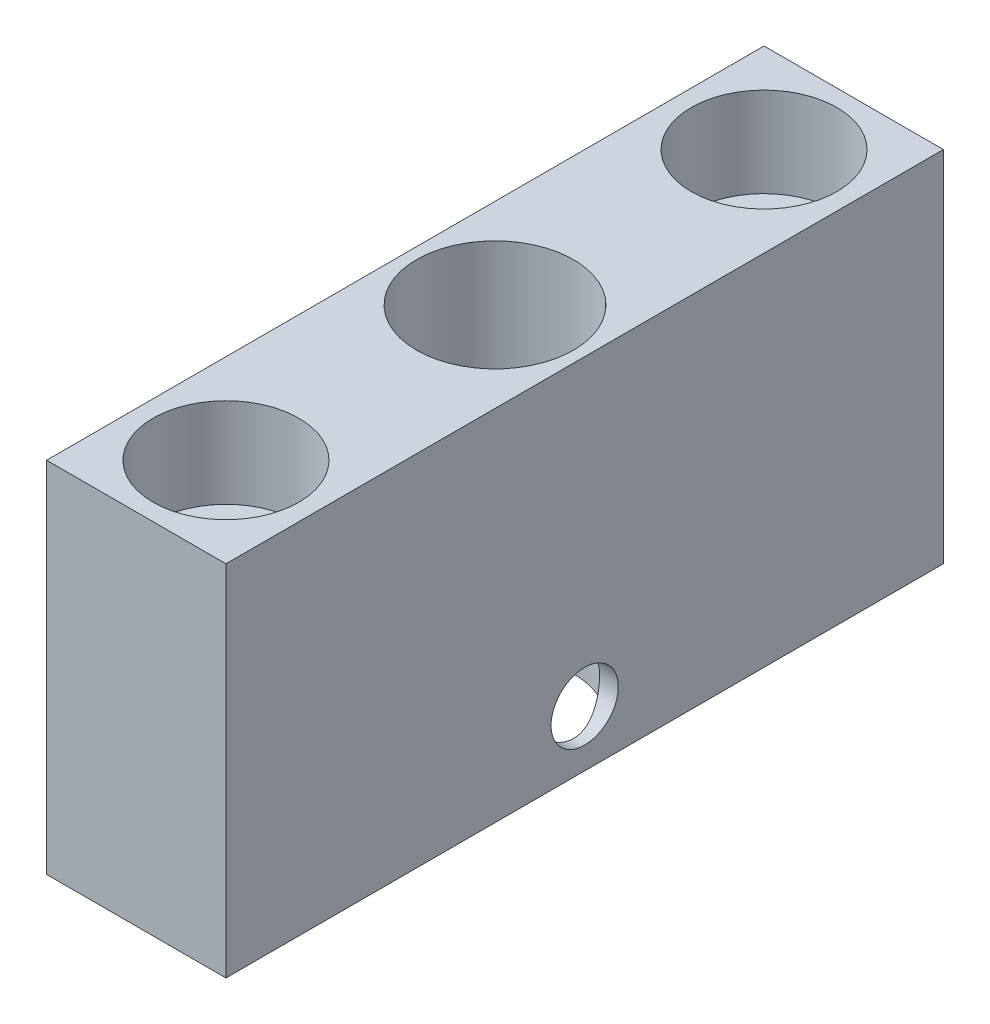
ISO-10303-21;
HEADER;
FILE_DESCRIPTION(('STEP AP214'),'2;1');
FILE_NAME('part.step','',(''),(''),'','','');
FILE_SCHEMA(('AUTOMOTIVE_DESIGN { 1 0 10303 214 1 1 1 1 }'));
ENDSEC;
DATA;
#1=APPLICATION_CONTEXT('core data for automotive mechanical design processes');
#2=APPLICATION_PROTOCOL_DEFINITION('international standard','automotive_design',2000,#1);
#3=PRODUCT_CONTEXT('',#1,'mechanical');
#4=PRODUCT('Part','Part','',(#3));
#5=PRODUCT_RELATED_PRODUCT_CATEGORY('part','',(#4));
#6=PRODUCT_DEFINITION_FORMATION('','',#4);
#7=PRODUCT_DEFINITION_CONTEXT('part definition',#1,'design');
#8=PRODUCT_DEFINITION('design','',#6,#7);
#9=PRODUCT_DEFINITION_SHAPE('','',#8);
#10=(LENGTH_UNIT() NAMED_UNIT(*) SI_UNIT(.MILLI.,.METRE.));
#11=(NAMED_UNIT(*) PLANE_ANGLE_UNIT() SI_UNIT($,.RADIAN.));
#12=(NAMED_UNIT(*) SI_UNIT($,.STERADIAN.) SOLID_ANGLE_UNIT());
#13=UNCERTAINTY_MEASURE_WITH_UNIT(LENGTH_MEASURE(1.E-05),#10,'distance_accuracy_value','');
#14=(GEOMETRIC_REPRESENTATION_CONTEXT(3) GLOBAL_UNCERTAINTY_ASSIGNED_CONTEXT((#13)) GLOBAL_UNIT_ASSIGNED_CONTEXT((#10,
#11,#12)) REPRESENTATION_CONTEXT('',''));
#15=CARTESIAN_POINT('',(0.,0.,0.));
#16=DIRECTION('',(0.,0.,1.));
#17=DIRECTION('',(1.,0.,0.));
#18=AXIS2_PLACEMENT_3D('',#15,#16,#17);
#19=CARTESIAN_POINT('',(25.4,50.8,0.));
#20=DIRECTION('',(0.,-1.,0.));
#21=DIRECTION('',(0.,0.,-1.));
#22=AXIS2_PLACEMENT_3D('',#19,#20,#21);
#23=PLANE('',#22);
#24=CARTESIAN_POINT('',(12.7,50.8,-12.7));
#25=DIRECTION('',(0.,1.,0.));
#26=DIRECTION('',(0.,0.,1.));
#27=AXIS2_PLACEMENT_3D('',#24,#25,#26);
#28=CIRCLE('',#27,10.31875);
#29=CARTESIAN_POINT('',(12.7,50.8,-2.38125));
#30=VERTEX_POINT('',#29);
#31=EDGE_CURVE('E195',#30,#30,#28,.T.);
#32=ORIENTED_EDGE('',*,*,#31,.F.);
#33=EDGE_LOOP('',(#32));
#34=FACE_BOUND('',#33,.T.);
#35=CARTESIAN_POINT('',(12.7,50.8,-50.8));
#36=DIRECTION('',(0.,1.,0.));
#37=DIRECTION('',(0.,0.,1.));
#38=AXIS2_PLACEMENT_3D('',#35,#36,#37);
#39=CIRCLE('',#38,11.1125);
#40=CARTESIAN_POINT('',(12.7,50.8,-39.6875));
#41=VERTEX_POINT('',#40);
#42=EDGE_CURVE('E183',#41,#41,#39,.T.);
#43=ORIENTED_EDGE('',*,*,#42,.F.);
#44=EDGE_LOOP('',(#43));
#45=FACE_BOUND('',#44,.T.);
#46=DIRECTION('',(0.,0.,1.));
#47=VECTOR('',#46,1.);
#48=CARTESIAN_POINT('',(0.,50.8,0.));
#49=LINE('',#48,#47);
#50=CARTESIAN_POINT('',(0.,50.8,-101.6));
#51=VERTEX_POINT('',#50);
#52=CARTESIAN_POINT('',(0.,50.8,0.));
#53=VERTEX_POINT('',#52);
#54=EDGE_CURVE('E79',#51,#53,#49,.T.);
#55=ORIENTED_EDGE('',*,*,#54,.T.);
#56=DIRECTION('',(-1.,0.,0.));
#57=VECTOR('',#56,1.);
#58=CARTESIAN_POINT('',(25.4,50.8,0.));
#59=LINE('',#58,#57);
#60=CARTESIAN_POINT('',(25.4,50.8,0.));
#61=VERTEX_POINT('',#60);
#62=EDGE_CURVE('E100',#61,#53,#59,.T.);
#63=ORIENTED_EDGE('',*,*,#62,.F.);
#64=DIRECTION('',(0.,0.,1.));
#65=VECTOR('',#64,1.);
#66=CARTESIAN_POINT('',(25.4,50.8,0.));
#67=LINE('',#66,#65);
#68=CARTESIAN_POINT('',(25.4,50.8,-101.6));
#69=VERTEX_POINT('',#68);
#70=EDGE_CURVE('E56',#69,#61,#67,.T.);
#71=ORIENTED_EDGE('',*,*,#70,.F.);
#72=DIRECTION('',(-1.,0.,0.));
#73=VECTOR('',#72,1.);
#74=CARTESIAN_POINT('',(25.4,50.8,-101.6));
#75=LINE('',#74,#73);
#76=EDGE_CURVE('E96',#69,#51,#75,.T.);
#77=ORIENTED_EDGE('',*,*,#76,.T.);
#78=EDGE_LOOP('',(#55,#63,#71,#77));
#79=FACE_BOUND('',#78,.T.);
#80=CARTESIAN_POINT('',(12.7,50.8,-88.9));
#81=DIRECTION('',(0.,1.,0.));
#82=DIRECTION('',(0.,0.,1.));
#83=AXIS2_PLACEMENT_3D('',#80,#81,#82);
#84=CIRCLE('',#83,10.31875);
#85=CARTESIAN_POINT('',(12.7,50.8,-78.58125));
#86=VERTEX_POINT('',#85);
#87=EDGE_CURVE('E205',#86,#86,#84,.T.);
#88=ORIENTED_EDGE('',*,*,#87,.F.);
#89=EDGE_LOOP('',(#88));
#90=FACE_BOUND('',#89,.T.);
#91=ADVANCED_FACE('F33',(#34,#45,#79,#90),#23,.F.);
#92=CARTESIAN_POINT('',(25.4,0.,0.));
#93=DIRECTION('',(0.,0.,-1.));
#94=DIRECTION('',(-1.,0.,0.));
#95=AXIS2_PLACEMENT_3D('',#92,#93,#94);
#96=PLANE('',#95);
#97=DIRECTION('',(0.,-1.,0.));
#98=VECTOR('',#97,1.);
#99=CARTESIAN_POINT('',(0.,0.,0.));
#100=LINE('',#99,#98);
#101=CARTESIAN_POINT('',(0.,0.,0.));
#102=VERTEX_POINT('',#101);
#103=EDGE_CURVE('E104',#53,#102,#100,.T.);
#104=ORIENTED_EDGE('',*,*,#103,.T.);
#105=DIRECTION('',(-1.,0.,0.));
#106=VECTOR('',#105,1.);
#107=CARTESIAN_POINT('',(25.4,0.,0.));
#108=LINE('',#107,#106);
#109=CARTESIAN_POINT('',(25.4,0.,0.));
#110=VERTEX_POINT('',#109);
#111=EDGE_CURVE('E11',#110,#102,#108,.T.);
#112=ORIENTED_EDGE('',*,*,#111,.F.);
#113=DIRECTION('',(0.,-1.,0.));
#114=VECTOR('',#113,1.);
#115=CARTESIAN_POINT('',(25.4,0.,0.));
#116=LINE('',#115,#114);
#117=EDGE_CURVE('E91',#61,#110,#116,.T.);
#118=ORIENTED_EDGE('',*,*,#117,.F.);
#119=ORIENTED_EDGE('',*,*,#62,.T.);
#120=EDGE_LOOP('',(#104,#112,#118,#119));
#121=FACE_BOUND('',#120,.T.);
#122=ADVANCED_FACE('F35',(#121),#96,.F.);
#123=CARTESIAN_POINT('',(25.4,0.,0.));
#124=DIRECTION('',(0.,1.,0.));
#125=DIRECTION('',(0.,0.,1.));
#126=AXIS2_PLACEMENT_3D('',#123,#124,#125);
#127=PLANE('',#126);
#128=CARTESIAN_POINT('',(12.7,0.,-88.9));
#129=DIRECTION('',(0.,1.,0.));
#130=DIRECTION('',(0.,0.,1.));
#131=AXIS2_PLACEMENT_3D('',#128,#129,#130);
#132=CIRCLE('',#131,6.74623999999999);
#133=CARTESIAN_POINT('',(12.7,0.,-82.15376));
#134=VERTEX_POINT('',#133);
#135=EDGE_CURVE('E176',#134,#134,#132,.T.);
#136=ORIENTED_EDGE('',*,*,#135,.T.);
#137=EDGE_LOOP('',(#136));
#138=FACE_BOUND('',#137,.T.);
#139=CARTESIAN_POINT('',(12.7,0.,-12.7));
#140=DIRECTION('',(0.,1.,0.));
#141=DIRECTION('',(0.,0.,1.));
#142=AXIS2_PLACEMENT_3D('',#139,#140,#141);
#143=CIRCLE('',#142,6.74623999999999);
#144=CARTESIAN_POINT('',(12.7,0.,-5.95376000000001));
#145=VERTEX_POINT('',#144);
#146=EDGE_CURVE('E179',#145,#145,#143,.T.);
#147=ORIENTED_EDGE('',*,*,#146,.T.);
#148=EDGE_LOOP('',(#147));
#149=FACE_BOUND('',#148,.T.);
#150=CARTESIAN_POINT('',(12.7,0.,-50.8));
#151=DIRECTION('',(0.,1.,0.));
#152=DIRECTION('',(0.,0.,1.));
#153=AXIS2_PLACEMENT_3D('',#150,#151,#152);
#154=CIRCLE('',#153,11.1125);
#155=CARTESIAN_POINT('',(12.7,0.,-39.6875));
#156=VERTEX_POINT('',#155);
#157=EDGE_CURVE('E107',#156,#156,#154,.T.);
#158=ORIENTED_EDGE('',*,*,#157,.T.);
#159=EDGE_LOOP('',(#158));
#160=FACE_BOUND('',#159,.T.);
#161=DIRECTION('',(0.,0.,-1.));
#162=VECTOR('',#161,1.);
#163=CARTESIAN_POINT('',(0.,0.,0.));
#164=LINE('',#163,#162);
#165=CARTESIAN_POINT('',(0.,0.,-101.6));
#166=VERTEX_POINT('',#165);
#167=EDGE_CURVE('E95',#102,#166,#164,.T.);
#168=ORIENTED_EDGE('',*,*,#167,.T.);
#169=DIRECTION('',(-1.,0.,0.));
#170=VECTOR('',#169,1.);
#171=CARTESIAN_POINT('',(25.4,0.,-101.6));
#172=LINE('',#171,#170);
#173=CARTESIAN_POINT('',(25.4,0.,-101.6));
#174=VERTEX_POINT('',#173);
#175=EDGE_CURVE('E47',#174,#166,#172,.T.);
#176=ORIENTED_EDGE('',*,*,#175,.F.);
#177=DIRECTION('',(0.,0.,-1.));
#178=VECTOR('',#177,1.);
#179=CARTESIAN_POINT('',(25.4,0.,0.));
#180=LINE('',#179,#178);
#181=EDGE_CURVE('E86',#110,#174,#180,.T.);
#182=ORIENTED_EDGE('',*,*,#181,.F.);
#183=ORIENTED_EDGE('',*,*,#111,.T.);
#184=EDGE_LOOP('',(#168,#176,#182,#183));
#185=FACE_BOUND('',#184,.T.);
#186=ADVANCED_FACE('F94',(#138,#149,#160,#185),#127,.F.);
#187=CARTESIAN_POINT('',(25.4,0.,-101.6));
#188=DIRECTION('',(0.,0.,1.));
#189=DIRECTION('',(1.,0.,0.));
#190=AXIS2_PLACEMENT_3D('',#187,#188,#189);
#191=PLANE('',#190);
#192=DIRECTION('',(0.,1.,0.));
#193=VECTOR('',#192,1.);
#194=CARTESIAN_POINT('',(0.,0.,-101.6));
#195=LINE('',#194,#193);
#196=EDGE_CURVE('E73',#166,#51,#195,.T.);
#197=ORIENTED_EDGE('',*,*,#196,.T.);
#198=ORIENTED_EDGE('',*,*,#76,.F.);
#199=DIRECTION('',(0.,1.,0.));
#200=VECTOR('',#199,1.);
#201=CARTESIAN_POINT('',(25.4,0.,-101.6));
#202=LINE('',#201,#200);
#203=EDGE_CURVE('E89',#174,#69,#202,.T.);
#204=ORIENTED_EDGE('',*,*,#203,.F.);
#205=ORIENTED_EDGE('',*,*,#175,.T.);
#206=EDGE_LOOP('',(#197,#198,#204,#205));
#207=FACE_BOUND('',#206,.T.);
#208=ADVANCED_FACE('F98',(#207),#191,.F.);
#209=CARTESIAN_POINT('',(25.4,0.,0.));
#210=DIRECTION('',(-1.,0.,0.));
#211=DIRECTION('',(0.,0.,1.));
#212=AXIS2_PLACEMENT_3D('',#209,#210,#211);
#213=PLANE('',#212);
#214=CARTESIAN_POINT('',(25.4,7.93749999999999,-50.8));
#215=DIRECTION('',(-1.,0.,0.));
#216=DIRECTION('',(0.,0.,1.));
#217=AXIS2_PLACEMENT_3D('',#214,#215,#216);
#218=CIRCLE('',#217,4.7625);
#219=CARTESIAN_POINT('',(25.4,7.93749999999999,-46.0375));
#220=VERTEX_POINT('',#219);
#221=EDGE_CURVE('E116',#220,#220,#218,.T.);
#222=ORIENTED_EDGE('',*,*,#221,.T.);
#223=EDGE_LOOP('',(#222));
#224=FACE_BOUND('',#223,.T.);
#225=ORIENTED_EDGE('',*,*,#117,.T.);
#226=ORIENTED_EDGE('',*,*,#181,.T.);
#227=ORIENTED_EDGE('',*,*,#203,.T.);
#228=ORIENTED_EDGE('',*,*,#70,.T.);
#229=EDGE_LOOP('',(#225,#226,#227,#228));
#230=FACE_BOUND('',#229,.T.);
#231=ADVANCED_FACE('F87',(#224,#230),#213,.F.);
#232=CARTESIAN_POINT('',(0.,0.,0.));
#233=DIRECTION('',(-1.,0.,0.));
#234=DIRECTION('',(0.,0.,1.));
#235=AXIS2_PLACEMENT_3D('',#232,#233,#234);
#236=PLANE('',#235);
#237=CARTESIAN_POINT('',(0.,7.93749999999999,-50.8));
#238=DIRECTION('',(-1.,0.,0.));
#239=DIRECTION('',(0.,0.,1.));
#240=AXIS2_PLACEMENT_3D('',#237,#238,#239);
#241=CIRCLE('',#240,4.7625);
#242=CARTESIAN_POINT('',(0.,7.93749999999999,-46.0375));
#243=VERTEX_POINT('',#242);
#244=EDGE_CURVE('E208',#243,#243,#241,.T.);
#245=ORIENTED_EDGE('',*,*,#244,.F.);
#246=EDGE_LOOP('',(#245));
#247=FACE_BOUND('',#246,.T.);
#248=ORIENTED_EDGE('',*,*,#103,.F.);
#249=ORIENTED_EDGE('',*,*,#54,.F.);
#250=ORIENTED_EDGE('',*,*,#196,.F.);
#251=ORIENTED_EDGE('',*,*,#167,.F.);
#252=EDGE_LOOP('',(#248,#249,#250,#251));
#253=FACE_BOUND('',#252,.T.);
#254=ADVANCED_FACE('F153',(#247,#253),#236,.T.);
#255=CARTESIAN_POINT('',(12.7,0.,-50.8));
#256=DIRECTION('',(0.,1.,0.));
#257=DIRECTION('',(0.,0.,1.));
#258=AXIS2_PLACEMENT_3D('',#255,#256,#257);
#259=CYLINDRICAL_SURFACE('',#258,11.1125);
#260=CARTESIAN_POINT('',(22.7402315710346,7.93749999999999,-46.0375));
#261=CARTESIAN_POINT('',(22.7402325969404,7.81081711955315,-46.0375009563788));
#262=CARTESIAN_POINT('',(22.7426375136056,7.68409356669935,-46.0425619607115));
#263=CARTESIAN_POINT('',(22.7521773469959,7.43157495339823,-46.0627531724795));
#264=CARTESIAN_POINT('',(22.7593152367777,7.30578052684223,-46.0778897089675));
#265=CARTESIAN_POINT('',(22.7780939995445,7.05586201053338,-46.1181018772274));
#266=CARTESIAN_POINT('',(22.7897441420218,6.93174190706319,-46.1431979714881));
#267=CARTESIAN_POINT('',(22.8171598826129,6.68627553562086,-46.2030646893261));
#268=CARTESIAN_POINT('',(22.8329272184985,6.56493046250162,-46.2378393984311));
#269=CARTESIAN_POINT('',(22.8679895638285,6.32641028596406,-46.3165316645889));
#270=CARTESIAN_POINT('',(22.8872676592125,6.20921827599237,-46.3604055189373));
#271=CARTESIAN_POINT('',(22.9288238220674,5.97907704550573,-46.4570075256631));
#272=CARTESIAN_POINT('',(22.9511030202539,5.86612944475673,-46.509739017162));
#273=CARTESIAN_POINT('',(23.0214847106019,5.53473411010628,-46.6805615431649));
#274=CARTESIAN_POINT('',(23.0731764446023,5.32344355082248,-46.8113772371487));
#275=CARTESIAN_POINT('',(23.1840302210821,4.91256550730841,-47.1121887461931));
#276=CARTESIAN_POINT('',(23.2434541391098,4.71443353112619,-47.284059781686));
#277=CARTESIAN_POINT('',(23.3609693699898,4.34862281350912,-47.658384469874));
#278=CARTESIAN_POINT('',(23.4190601433558,4.18095621711117,-47.8608502605265));
#279=CARTESIAN_POINT('',(23.5020251157082,3.95217119433691,-48.1889630020797));
#280=CARTESIAN_POINT('',(23.529543805133,3.87833617785003,-48.3052775653519));
#281=CARTESIAN_POINT('',(23.5818420364386,3.74080074445626,-48.5443172030064));
#282=CARTESIAN_POINT('',(23.6066227201098,3.67709609812437,-48.6670395735549));
#283=CARTESIAN_POINT('',(23.6527361704598,3.56039435942118,-48.9181062685213));
#284=CARTESIAN_POINT('',(23.6740686566785,3.50739813793502,-49.0464510491614));
#285=CARTESIAN_POINT('',(23.7126442464736,3.41268453784225,-49.3077700416603));
#286=CARTESIAN_POINT('',(23.7298894226294,3.37096144138833,-49.4407418678532));
#287=CARTESIAN_POINT('',(23.7589645161395,3.30118728442444,-49.7029986863095));
#288=CARTESIAN_POINT('',(23.7710375060906,3.27251718465848,-49.8320921980915));
#289=CARTESIAN_POINT('',(23.7907227036859,3.22599010247466,-50.0924945957469));
#290=CARTESIAN_POINT('',(23.7983369227396,3.2081282441973,-50.2238024551533));
#291=CARTESIAN_POINT('',(23.8088927374394,3.18340987866286,-50.4876167517058));
#292=CARTESIAN_POINT('',(23.8118350655803,3.17655164617131,-50.6201229976826));
#293=CARTESIAN_POINT('',(23.8129635440452,3.17391827416849,-50.8852632517531));
#294=CARTESIAN_POINT('',(23.8111498916125,3.17814267503059,-51.0178972543203));
#295=CARTESIAN_POINT('',(23.8030899023065,3.1969915207815,-51.2736572238331));
#296=CARTESIAN_POINT('',(23.7971374396123,3.21092660137181,-51.3968439819731));
#297=CARTESIAN_POINT('',(23.7812677768779,3.24830694302233,-51.6415464574278));
#298=CARTESIAN_POINT('',(23.7713492698737,3.27175533912293,-51.7630616102162));
#299=CARTESIAN_POINT('',(23.7477949789557,3.3279256747242,-52.0035215780315));
#300=CARTESIAN_POINT('',(23.734160430392,3.36064453252227,-52.1224672330975));
#301=CARTESIAN_POINT('',(23.7035070800928,3.43504991614925,-52.3570875456178));
#302=CARTESIAN_POINT('',(23.6864869858923,3.4767398672792,-52.4727609345299));
#303=CARTESIAN_POINT('',(23.6303729511955,3.61613562312503,-52.8171892422505));
#304=CARTESIAN_POINT('',(23.5865804410412,3.72735286321166,-53.0398847261039));
#305=CARTESIAN_POINT('',(23.4906732532717,3.98196726986346,-53.4639196547825));
#306=CARTESIAN_POINT('',(23.4385555878285,4.12537599719917,-53.6652513889999));
#307=CARTESIAN_POINT('',(23.3266292662245,4.45262138276372,-54.0568159113248));
#308=CARTESIAN_POINT('',(23.2665368722658,4.63866362567251,-54.2451265366349));
#309=CARTESIAN_POINT('',(23.1482447303289,5.03988209313429,-54.588792131285));
#310=CARTESIAN_POINT('',(23.0900458084769,5.2550708284467,-54.7441328748182));
#311=CARTESIAN_POINT('',(23.0080841218763,5.60008928812737,-54.9517319893531));
#312=CARTESIAN_POINT('',(22.9812256744591,5.72117264752324,-55.0176264196652));
#313=CARTESIAN_POINT('',(22.9306452318648,5.96911134117193,-55.1388785284375));
#314=CARTESIAN_POINT('',(22.9069218642793,6.09596411690436,-55.1942408221287));
#315=CARTESIAN_POINT('',(22.8634458090569,6.35458276658959,-55.293883043541));
#316=CARTESIAN_POINT('',(22.8436924590987,6.48634781666808,-55.3381648201362));
#317=CARTESIAN_POINT('',(22.8089032030434,6.75376488742944,-55.4151402633162));
#318=CARTESIAN_POINT('',(22.7938647576959,6.88941477279269,-55.4478401686471));
#319=CARTESIAN_POINT('',(22.7699246654428,7.15433232140047,-55.4994709480565));
#320=CARTESIAN_POINT('',(22.7606790992216,7.28341791242463,-55.5191781527133));
#321=CARTESIAN_POINT('',(22.7471446489349,7.5429754466383,-55.5479253704658));
#322=CARTESIAN_POINT('',(22.7428534835363,7.67344672381315,-55.5569702932199));
#323=CARTESIAN_POINT('',(22.7393821403968,7.93474312753004,-55.5642920886695));
#324=CARTESIAN_POINT('',(22.7402013386981,8.06556820892421,-55.562570275946));
#325=CARTESIAN_POINT('',(22.7469178556913,8.32649805848893,-55.5483848535375));
#326=CARTESIAN_POINT('',(22.7528150033793,8.45660285076728,-55.5359216055784));
#327=CARTESIAN_POINT('',(22.7688871369255,8.70602210688869,-55.5016485340732));
#328=CARTESIAN_POINT('',(22.7787349853001,8.8254561296551,-55.4805514170496));
#329=CARTESIAN_POINT('',(22.8023216104455,9.06201631435729,-55.4294206385016));
#330=CARTESIAN_POINT('',(22.816061655543,9.17914171066591,-55.3993840637682));
#331=CARTESIAN_POINT('',(22.8625277917537,9.52589509681601,-55.2962707749795));
#332=CARTESIAN_POINT('',(22.9005128967651,9.75108699188258,-55.2101644074141));
#333=CARTESIAN_POINT('',(22.9882190863004,10.1937090721676,-55.0016008796227));
#334=CARTESIAN_POINT('',(23.0383786296689,10.4103760840485,-54.8777260071983));
#335=CARTESIAN_POINT('',(23.1441893772466,10.8209410272629,-54.5985352919396));
#336=CARTESIAN_POINT('',(23.1998430461826,11.014828653301,-54.4432053048334));
#337=CARTESIAN_POINT('',(23.3162454816267,11.3919725300852,-54.0894453640814));
#338=CARTESIAN_POINT('',(23.3770159298943,11.5728329421733,-53.8884401852249));
#339=CARTESIAN_POINT('',(23.4634529566788,11.8171208649245,-53.5655457006457));
#340=CARTESIAN_POINT('',(23.4914946070146,11.8940886308069,-53.4542749287281));
#341=CARTESIAN_POINT('',(23.5452693574178,12.038488849397,-53.2252004550138));
#342=CARTESIAN_POINT('',(23.5710034517024,12.1059254159359,-53.1073996024677));
#343=CARTESIAN_POINT('',(23.6195894546555,12.2310447636973,-52.865321094792));
#344=CARTESIAN_POINT('',(23.6424249231112,12.2886724901005,-52.7410116927326));
#345=CARTESIAN_POINT('',(23.684391391894,12.3931585921314,-52.4873972280789));
#346=CARTESIAN_POINT('',(23.703523997519,12.4400216362133,-52.3580943595918));
#347=CARTESIAN_POINT('',(23.737527784676,12.5224952762375,-52.0954405312268));
#348=CARTESIAN_POINT('',(23.7524002298111,12.5581092090931,-51.9620907846959));
#349=CARTESIAN_POINT('',(23.7774386369058,12.6176847498363,-51.6923815889954));
#350=CARTESIAN_POINT('',(23.7876049776739,12.641647295587,-51.5560223829923));
#351=CARTESIAN_POINT('',(23.8023543434429,12.676302269857,-51.2915478069043));
#352=CARTESIAN_POINT('',(23.8072925381708,12.6878399259913,-51.1635623458025));
#353=CARTESIAN_POINT('',(23.8127267199299,12.7005325481124,-50.9069365060749));
#354=CARTESIAN_POINT('',(23.8132212167406,12.701684031035,-50.7782959222193));
#355=CARTESIAN_POINT('',(23.8097508682729,12.6935832074007,-50.5214763083617));
#356=CARTESIAN_POINT('',(23.8057885052258,12.6843366919705,-50.3932970612895));
#357=CARTESIAN_POINT('',(23.7935147439634,12.655549189478,-50.1382647070866));
#358=CARTESIAN_POINT('',(23.7852017282081,12.6360043735661,-50.0114121110989));
#359=CARTESIAN_POINT('',(23.7648587180221,12.58780188604,-49.765000058004));
#360=CARTESIAN_POINT('',(23.7529889280872,12.5595356744361,-49.6453507026645));
#361=CARTESIAN_POINT('',(23.7257344865117,12.493973333606,-49.4089475465436));
#362=CARTESIAN_POINT('',(23.7103486120573,12.4566740626179,-49.2921947688223));
#363=CARTESIAN_POINT('',(23.6594457022784,12.3317084906314,-48.9474404480888));
#364=CARTESIAN_POINT('',(23.6191657761472,12.2309343468457,-48.7247404838586));
#365=CARTESIAN_POINT('',(23.5275103738181,11.9922956185013,-48.2891051269723));
#366=CARTESIAN_POINT('',(23.4757125102392,11.8529485534729,-48.0770788292141));
#367=CARTESIAN_POINT('',(23.3670759497092,11.5432333315046,-47.6784838070674));
#368=CARTESIAN_POINT('',(23.3102352629014,11.3728529008783,-47.4919252064003));
#369=CARTESIAN_POINT('',(23.1926674661581,10.9911877634417,-47.1353926399548));
#370=CARTESIAN_POINT('',(23.1319579298297,10.777830943723,-46.9676073671342));
#371=CARTESIAN_POINT('',(23.0463176018151,10.4379227536367,-46.7444166644606));
#372=CARTESIAN_POINT('',(23.0186531320894,10.3211976917029,-46.6747194535614));
#373=CARTESIAN_POINT('',(22.9659877031333,10.0817641380894,-46.5453529397522));
#374=CARTESIAN_POINT('',(22.9409855344711,9.95905840056385,-46.4856790762542));
#375=CARTESIAN_POINT('',(22.8944995742002,9.70857282965038,-46.3769544233052));
#376=CARTESIAN_POINT('',(22.8730114805165,9.58079944216751,-46.3278906204867));
#377=CARTESIAN_POINT('',(22.8342864121107,9.32097238715718,-46.2408150478807));
#378=CARTESIAN_POINT('',(22.8170473340895,9.18892087411469,-46.2027978082762));
#379=CARTESIAN_POINT('',(22.7874998003113,8.92186199191321,-46.1383199649313));
#380=CARTESIAN_POINT('',(22.7751783660065,8.78686340838854,-46.1118289245687));
#381=CARTESIAN_POINT('',(22.7558994206209,8.51477350400633,-46.0706166078036));
#382=CARTESIAN_POINT('',(22.7489377991736,8.3776838691965,-46.0558863119268));
#383=CARTESIAN_POINT('',(22.7432747601674,8.18981511399056,-46.0439201771626));
#384=CARTESIAN_POINT('',(22.7421344611403,8.13939161144365,-46.0415134125));
#385=CARTESIAN_POINT('',(22.7406126560461,8.03848089379232,-46.0383031204881));
#386=CARTESIAN_POINT('',(22.7402311621257,7.98799367768092,-46.0374996188034));
#387=CARTESIAN_POINT('',(22.7402315710346,7.93749999999999,-46.0375));
#388=B_SPLINE_CURVE_WITH_KNOTS('',3,(#260,#261,#262,#263,#264,#265,#266,#267,#268,#269,#270,
#271,#272,#273,#274,#275,#276,#277,#278,#279,#280,#281,#282,#283,#284,#285,#286,#287,#288,#289,
#290,#291,#292,#293,#294,#295,#296,#297,#298,#299,#300,#301,#302,#303,#304,#305,#306,#307,#308,
#309,#310,#311,#312,#313,#314,#315,#316,#317,#318,#319,#320,#321,#322,#323,#324,#325,#326,#327,
#328,#329,#330,#331,#332,#333,#334,#335,#336,#337,#338,#339,#340,#341,#342,#343,#344,#345,#346,
#347,#348,#349,#350,#351,#352,#353,#354,#355,#356,#357,#358,#359,#360,#361,#362,#363,#364,#365,
#366,#367,#368,#369,#370,#371,#372,#373,#374,#375,#376,#377,#378,#379,#380,#381,#382,#383,#384,
#385,#386,#387),.UNSPECIFIED.,.T.,.F.,(4,2,2,2,2,2,2,2,2,2,2,2,2,2,2,2,2,2,2,2,2,2,2,2,2,2,2,2,
2,2,2,2,2,2,2,2,2,2,2,2,2,2,2,2,2,2,2,2,2,2,2,2,2,2,2,2,2,2,2,2,2,2,2,4),(0.,0.37999614743422,
0.76023121903024,1.14125158394574,1.52243302938755,1.90182440554225,2.28135912565192,
3.03951136369128,3.84300275967303,4.64681376843501,5.06784254342269,5.48869507495356,
5.90958181943645,6.33025468327845,6.72810029452656,7.1257662939162,7.52336993802682,
7.92095709270492,8.29286402725796,8.66489362057616,9.03679968798994,9.40884800760228,
10.1635571437602,10.9185377497518,11.7293564208535,12.5405242350144,12.9614018841596,
13.3820946757899,13.8027172245334,14.2231128529017,14.6153153058753,15.0073370908476,
15.3993110122572,15.7912717341618,16.1558879487007,16.5206231154771,17.2495332786101,
18.0101355645941,18.7710806294892,19.598285755281,20.0123966307314,20.4263282192943,
20.8425115379309,21.25851402294,21.6743929896754,22.090238475231,22.4755480808171,
22.8609868974451,23.2462111516252,23.631578731155,24.0016878682786,24.3719259173178,
25.1117880001847,25.8854064142082,26.6593314610766,27.4894672598559,27.9052589143608,
28.3208608696201,28.7359501560337,29.1508335551684,29.5646146445828,29.978078094037,
30.1295357794085,30.2809958892581),.UNSPECIFIED.);
#389=CARTESIAN_POINT('',(22.7402315710346,7.93749999999999,-46.0375));
#390=VERTEX_POINT('',#389);
#391=EDGE_CURVE('E37',#390,#390,#388,.T.);
#392=ORIENTED_EDGE('',*,*,#391,.T.);
#393=EDGE_LOOP('',(#392));
#394=FACE_BOUND('',#393,.T.);
#395=CARTESIAN_POINT('',(2.65976842896539,7.93749999999999,-46.0375));
#396=CARTESIAN_POINT('',(2.65976740305958,8.06418288044683,-46.0375009563788));
#397=CARTESIAN_POINT('',(2.65736248639442,8.19090643330063,-46.0425619607115));
#398=CARTESIAN_POINT('',(2.64782265300405,8.44342504660175,-46.0627531724795));
#399=CARTESIAN_POINT('',(2.64068476322232,8.56921947315775,-46.0778897089675));
#400=CARTESIAN_POINT('',(2.62190600045549,8.8191379894666,-46.1181018772274));
#401=CARTESIAN_POINT('',(2.61025585797822,8.9432580929368,-46.1431979714881));
#402=CARTESIAN_POINT('',(2.58284011738707,9.18872446437912,-46.2030646893261));
#403=CARTESIAN_POINT('',(2.5670727815015,9.31006953749836,-46.2378393984311));
#404=CARTESIAN_POINT('',(2.53201043617152,9.54858971403593,-46.3165316645889));
#405=CARTESIAN_POINT('',(2.51273234078748,9.66578172400762,-46.3604055189373));
#406=CARTESIAN_POINT('',(2.47117617793261,9.89592295449426,-46.4570075256631));
#407=CARTESIAN_POINT('',(2.4488969797461,10.0088705552433,-46.509739017162));
#408=CARTESIAN_POINT('',(2.37851528939814,10.3402658898937,-46.6805615431649));
#409=CARTESIAN_POINT('',(2.32682355539766,10.5515564491775,-46.8113772371487));
#410=CARTESIAN_POINT('',(2.21596977891787,10.9624344926916,-47.1121887461931));
#411=CARTESIAN_POINT('',(2.15654586089017,11.1605664688738,-47.284059781686));
#412=CARTESIAN_POINT('',(2.0390306300102,11.5263771864909,-47.658384469874));
#413=CARTESIAN_POINT('',(1.98093985664415,11.6940437828888,-47.8608502605264));
#414=CARTESIAN_POINT('',(1.89797488429183,11.9228288056631,-48.1889630020797));
#415=CARTESIAN_POINT('',(1.87045619486702,11.9966638221499,-48.3052775653518));
#416=CARTESIAN_POINT('',(1.81815796356143,12.1341992555437,-48.5443172030064));
#417=CARTESIAN_POINT('',(1.79337727989024,12.1979039018756,-48.6670395735549));
#418=CARTESIAN_POINT('',(1.74726382954022,12.3146056405788,-48.9181062685212));
#419=CARTESIAN_POINT('',(1.72593134332148,12.367601862065,-49.0464510491614));
#420=CARTESIAN_POINT('',(1.68735575352639,12.4623154621577,-49.3077700416603));
#421=CARTESIAN_POINT('',(1.67011057737059,12.5040385586117,-49.4407418678532));
#422=CARTESIAN_POINT('',(1.6410354838605,12.5738127155755,-49.7029986863095));
#423=CARTESIAN_POINT('',(1.62896249390939,12.6024828153415,-49.8320921980915));
#424=CARTESIAN_POINT('',(1.60927729631405,12.6490098975253,-50.0924945957469));
#425=CARTESIAN_POINT('',(1.60166307726037,12.6668717558027,-50.2238024551533));
#426=CARTESIAN_POINT('',(1.59110726256061,12.6915901213371,-50.4876167517058));
#427=CARTESIAN_POINT('',(1.5881649344197,12.6984483538287,-50.6201229976826));
#428=CARTESIAN_POINT('',(1.5870364559548,12.7010817258315,-50.8852632517531));
#429=CARTESIAN_POINT('',(1.5888501083875,12.6968573249694,-51.0178972543203));
#430=CARTESIAN_POINT('',(1.59691009769355,12.6780084792185,-51.2736572238331));
#431=CARTESIAN_POINT('',(1.60286256038772,12.6640733986282,-51.3968439819731));
#432=CARTESIAN_POINT('',(1.61873222312206,12.6266930569777,-51.6415464574278));
#433=CARTESIAN_POINT('',(1.62865073012625,12.603244660877,-51.7630616102162));
#434=CARTESIAN_POINT('',(1.65220502104428,12.5470743252758,-52.0035215780315));
#435=CARTESIAN_POINT('',(1.66583956960801,12.5143554674777,-52.1224672330975));
#436=CARTESIAN_POINT('',(1.69649291990723,12.4399500838507,-52.3570875456178));
#437=CARTESIAN_POINT('',(1.71351301410774,12.3982601327208,-52.4727609345299));
#438=CARTESIAN_POINT('',(1.76962704880446,12.258864376875,-52.8171892422505));
#439=CARTESIAN_POINT('',(1.81341955895881,12.1476471367883,-53.0398847261039));
#440=CARTESIAN_POINT('',(1.9093267467283,11.8930327301365,-53.4639196547825));
#441=CARTESIAN_POINT('',(1.96144441217155,11.7496240028008,-53.6652513889999));
#442=CARTESIAN_POINT('',(2.0733707337755,11.4223786172363,-54.0568159113248));
#443=CARTESIAN_POINT('',(2.13346312773416,11.2363363743275,-54.2451265366349));
#444=CARTESIAN_POINT('',(2.25175526967113,10.8351179068657,-54.588792131285));
#445=CARTESIAN_POINT('',(2.3099541915231,10.6199291715533,-54.7441328748182));
#446=CARTESIAN_POINT('',(2.39191587812367,10.2749107118726,-54.9517319893531));
#447=CARTESIAN_POINT('',(2.41877432554094,10.1538273524767,-55.0176264196652));
#448=CARTESIAN_POINT('',(2.46935476813524,9.90588865882805,-55.1388785284375));
#449=CARTESIAN_POINT('',(2.49307813572074,9.77903588309562,-55.1942408221287));
#450=CARTESIAN_POINT('',(2.53655419094312,9.52041723341039,-55.293883043541));
#451=CARTESIAN_POINT('',(2.55630754090128,9.38865218333191,-55.3381648201362));
#452=CARTESIAN_POINT('',(2.59109679695663,9.12123511257055,-55.4151402633162));
#453=CARTESIAN_POINT('',(2.60613524230408,8.98558522720729,-55.4478401686471));
#454=CARTESIAN_POINT('',(2.63007533455724,8.72066767859951,-55.4994709480565));
#455=CARTESIAN_POINT('',(2.6393209007784,8.59158208757536,-55.5191781527133));
#456=CARTESIAN_POINT('',(2.65285535106512,8.33202455336169,-55.5479253704658));
#457=CARTESIAN_POINT('',(2.65714651646368,8.20155327618684,-55.5569702932199));
#458=CARTESIAN_POINT('',(2.66061785960321,7.94025687246994,-55.5642920886695));
#459=CARTESIAN_POINT('',(2.65979866130186,7.80943179107577,-55.562570275946));
#460=CARTESIAN_POINT('',(2.65308214430868,7.54850194151105,-55.5483848535375));
#461=CARTESIAN_POINT('',(2.64718499662069,7.4183971492327,-55.5359216055784));
#462=CARTESIAN_POINT('',(2.63111286307451,7.1689778931113,-55.5016485340732));
#463=CARTESIAN_POINT('',(2.62126501469993,7.04954387034488,-55.4805514170496));
#464=CARTESIAN_POINT('',(2.59767838955453,6.81298368564269,-55.4294206385016));
#465=CARTESIAN_POINT('',(2.58393834445702,6.69585828933407,-55.3993840637682));
#466=CARTESIAN_POINT('',(2.53747220824626,6.34910490318397,-55.2962707749795));
#467=CARTESIAN_POINT('',(2.49948710323492,6.12391300811741,-55.2101644074141));
#468=CARTESIAN_POINT('',(2.41178091369962,5.68129092783241,-55.0016008796227));
#469=CARTESIAN_POINT('',(2.36162137033108,5.4646239159515,-54.8777260071983));
#470=CARTESIAN_POINT('',(2.2558106227534,5.05405897273709,-54.5985352919396));
#471=CARTESIAN_POINT('',(2.20015695381737,4.86017134669897,-54.4432053048334));
#472=CARTESIAN_POINT('',(2.08375451837329,4.48302746991482,-54.0894453640814));
#473=CARTESIAN_POINT('',(2.0229840701057,4.30216705782668,-53.8884401852249));
#474=CARTESIAN_POINT('',(1.93654704332118,4.05787913507552,-53.5655457006457));
#475=CARTESIAN_POINT('',(1.9085053929854,3.9809113691931,-53.4542749287281));
#476=CARTESIAN_POINT('',(1.85473064258224,3.83651115060302,-53.2252004550138));
#477=CARTESIAN_POINT('',(1.82899654829764,3.76907458406405,-53.1073996024677));
#478=CARTESIAN_POINT('',(1.78041054534446,3.64395523630263,-52.865321094792));
#479=CARTESIAN_POINT('',(1.75757507688882,3.58632750989946,-52.7410116927326));
#480=CARTESIAN_POINT('',(1.71560860810597,3.4818414078686,-52.4873972280789));
#481=CARTESIAN_POINT('',(1.69647600248099,3.43497836378666,-52.3580943595918));
#482=CARTESIAN_POINT('',(1.66247221532404,3.35250472376253,-52.0954405312268));
#483=CARTESIAN_POINT('',(1.64759977018889,3.3168907909069,-51.9620907846959));
#484=CARTESIAN_POINT('',(1.6225613630942,3.25731525016373,-51.6923815889954));
#485=CARTESIAN_POINT('',(1.61239502232609,3.23335270441295,-51.5560223829923));
#486=CARTESIAN_POINT('',(1.59764565655714,3.19869773014296,-51.2915478069043));
#487=CARTESIAN_POINT('',(1.59270746182917,3.18716007400867,-51.1635623458025));
#488=CARTESIAN_POINT('',(1.58727328007006,3.17446745188754,-50.9069365060749));
#489=CARTESIAN_POINT('',(1.58677878325938,3.17331596896501,-50.7782959222193));
#490=CARTESIAN_POINT('',(1.59024913172711,3.18141679259929,-50.5214763083617));
#491=CARTESIAN_POINT('',(1.59421149477424,3.19066330802944,-50.3932970612895));
#492=CARTESIAN_POINT('',(1.60648525603657,3.21945081052203,-50.1382647070866));
#493=CARTESIAN_POINT('',(1.61479827179193,3.23899562643391,-50.0114121110989));
#494=CARTESIAN_POINT('',(1.63514128197787,3.28719811396001,-49.765000058004));
#495=CARTESIAN_POINT('',(1.64701107191282,3.31546432556388,-49.6453507026645));
#496=CARTESIAN_POINT('',(1.67426551348831,3.38102666639394,-49.4089475465436));
#497=CARTESIAN_POINT('',(1.68965138794274,3.41832593738206,-49.2921947688223));
#498=CARTESIAN_POINT('',(1.74055429772163,3.54329150936861,-48.9474404480888));
#499=CARTESIAN_POINT('',(1.78083422385285,3.64406565315429,-48.7247404838586));
#500=CARTESIAN_POINT('',(1.87248962618192,3.8827043814987,-48.2891051269723));
#501=CARTESIAN_POINT('',(1.92428748976079,4.02205144652708,-48.0770788292141));
#502=CARTESIAN_POINT('',(2.03292405029084,4.33176666849541,-47.6784838070674));
#503=CARTESIAN_POINT('',(2.0897647370986,4.50214709912172,-47.4919252064003));
#504=CARTESIAN_POINT('',(2.20733253384185,4.88381223655832,-47.1353926399548));
#505=CARTESIAN_POINT('',(2.26804207017027,5.09716905627702,-46.9676073671342));
#506=CARTESIAN_POINT('',(2.35368239818489,5.43707724636331,-46.7444166644606));
#507=CARTESIAN_POINT('',(2.38134686791061,5.55380230829704,-46.6747194535614));
#508=CARTESIAN_POINT('',(2.43401229686673,5.79323586191062,-46.5453529397522));
#509=CARTESIAN_POINT('',(2.4590144655289,5.91594159943613,-46.4856790762542));
#510=CARTESIAN_POINT('',(2.50550042579978,6.16642717034961,-46.3769544233052));
#511=CARTESIAN_POINT('',(2.52698851948345,6.29420055783248,-46.3278906204867));
#512=CARTESIAN_POINT('',(2.56571358788928,6.55402761284281,-46.2408150478807));
#513=CARTESIAN_POINT('',(2.58295266591051,6.6860791258853,-46.2027978082761));
#514=CARTESIAN_POINT('',(2.6125001996887,6.95313800808678,-46.1383199649313));
#515=CARTESIAN_POINT('',(2.62482163399347,7.08813659161145,-46.1118289245687));
#516=CARTESIAN_POINT('',(2.64410057937906,7.36022649599366,-46.0706166078036));
#517=CARTESIAN_POINT('',(2.65106220082642,7.49731613080349,-46.0558863119268));
#518=CARTESIAN_POINT('',(2.65672523983259,7.68518488600944,-46.0439201771626));
#519=CARTESIAN_POINT('',(2.65786553885967,7.73560838855634,-46.0415134125));
#520=CARTESIAN_POINT('',(2.6593873439539,7.83651910620767,-46.0383031204881));
#521=CARTESIAN_POINT('',(2.65976883787429,7.88700632231907,-46.0374996188034));
#522=CARTESIAN_POINT('',(2.65976842896539,7.93749999999999,-46.0375));
#523=B_SPLINE_CURVE_WITH_KNOTS('',3,(#395,#396,#397,#398,#399,#400,#401,#402,#403,#404,#405,
#406,#407,#408,#409,#410,#411,#412,#413,#414,#415,#416,#417,#418,#419,#420,#421,#422,#423,#424,
#425,#426,#427,#428,#429,#430,#431,#432,#433,#434,#435,#436,#437,#438,#439,#440,#441,#442,#443,
#444,#445,#446,#447,#448,#449,#450,#451,#452,#453,#454,#455,#456,#457,#458,#459,#460,#461,#462,
#463,#464,#465,#466,#467,#468,#469,#470,#471,#472,#473,#474,#475,#476,#477,#478,#479,#480,#481,
#482,#483,#484,#485,#486,#487,#488,#489,#490,#491,#492,#493,#494,#495,#496,#497,#498,#499,#500,
#501,#502,#503,#504,#505,#506,#507,#508,#509,#510,#511,#512,#513,#514,#515,#516,#517,#518,#519,
#520,#521,#522),.UNSPECIFIED.,.T.,.F.,(4,2,2,2,2,2,2,2,2,2,2,2,2,2,2,2,2,2,2,2,2,2,2,2,2,2,2,2,
2,2,2,2,2,2,2,2,2,2,2,2,2,2,2,2,2,2,2,2,2,2,2,2,2,2,2,2,2,2,2,2,2,2,2,4),(0.,0.379996147434217,
0.760231219030237,1.14125158394574,1.52243302938755,1.90182440554225,2.28135912565192,
3.03951136369128,3.84300275967303,4.64681376843501,5.06784254342268,5.48869507495356,
5.90958181943643,6.33025468327845,6.72810029452656,7.1257662939162,7.52336993802681,
7.92095709270492,8.29286402725796,8.66489362057616,9.03679968798993,9.40884800760228,
10.1635571437602,10.9185377497518,11.7293564208535,12.5405242350144,12.9614018841596,
13.3820946757899,13.8027172245334,14.2231128529017,14.6153153058753,15.0073370908476,
15.3993110122572,15.7912717341618,16.1558879487007,16.5206231154771,17.2495332786101,
18.0101355645941,18.7710806294892,19.598285755281,20.0123966307314,20.4263282192943,
20.8425115379309,21.25851402294,21.6743929896754,22.090238475231,22.4755480808171,
22.8609868974451,23.2462111516252,23.631578731155,24.0016878682787,24.3719259173178,
25.1117880001847,25.8854064142082,26.6593314610767,27.4894672598559,27.9052589143608,
28.3208608696201,28.7359501560337,29.1508335551684,29.5646146445828,29.978078094037,
30.1295357794085,30.2809958892581),.UNSPECIFIED.);
#524=CARTESIAN_POINT('',(2.65976842896539,7.93749999999999,-46.0375));
#525=VERTEX_POINT('',#524);
#526=EDGE_CURVE('E112',#525,#525,#523,.T.);
#527=ORIENTED_EDGE('',*,*,#526,.T.);
#528=EDGE_LOOP('',(#527));
#529=FACE_BOUND('',#528,.T.);
#530=ORIENTED_EDGE('',*,*,#157,.F.);
#531=EDGE_LOOP('',(#530));
#532=FACE_BOUND('',#531,.T.);
#533=ORIENTED_EDGE('',*,*,#42,.T.);
#534=EDGE_LOOP('',(#533));
#535=FACE_BOUND('',#534,.T.);
#536=ADVANCED_FACE('F117',(#394,#529,#532,#535),#259,.F.);
#537=CARTESIAN_POINT('',(12.7,50.8,-12.7));
#538=DIRECTION('',(0.,1.,0.));
#539=DIRECTION('',(0.,0.,1.));
#540=AXIS2_PLACEMENT_3D('',#537,#538,#539);
#541=CYLINDRICAL_SURFACE('',#540,6.74623999999999);
#542=ORIENTED_EDGE('',*,*,#146,.F.);
#543=EDGE_LOOP('',(#542));
#544=FACE_BOUND('',#543,.T.);
#545=CARTESIAN_POINT('',(12.7,38.1,-12.7));
#546=DIRECTION('',(0.,1.,0.));
#547=DIRECTION('',(0.,0.,1.));
#548=AXIS2_PLACEMENT_3D('',#545,#546,#547);
#549=CIRCLE('',#548,6.74623999999999);
#550=CARTESIAN_POINT('',(12.7,38.1,-5.95376));
#551=VERTEX_POINT('',#550);
#552=EDGE_CURVE('E189',#551,#551,#549,.T.);
#553=ORIENTED_EDGE('',*,*,#552,.T.);
#554=EDGE_LOOP('',(#553));
#555=FACE_BOUND('',#554,.T.);
#556=ADVANCED_FACE('F146',(#544,#555),#541,.F.);
#557=CARTESIAN_POINT('',(19.44624,38.1,-12.7));
#558=DIRECTION('',(0.,-1.,0.));
#559=DIRECTION('',(0.,0.,-1.));
#560=AXIS2_PLACEMENT_3D('',#557,#558,#559);
#561=PLANE('',#560);
#562=ORIENTED_EDGE('',*,*,#552,.F.);
#563=EDGE_LOOP('',(#562));
#564=FACE_BOUND('',#563,.T.);
#565=CARTESIAN_POINT('',(12.7,38.1,-12.7));
#566=DIRECTION('',(0.,1.,0.));
#567=DIRECTION('',(0.,0.,1.));
#568=AXIS2_PLACEMENT_3D('',#565,#566,#567);
#569=CIRCLE('',#568,10.31875);
#570=CARTESIAN_POINT('',(12.7,38.1,-2.38125));
#571=VERTEX_POINT('',#570);
#572=EDGE_CURVE('E192',#571,#571,#569,.T.);
#573=ORIENTED_EDGE('',*,*,#572,.T.);
#574=EDGE_LOOP('',(#573));
#575=FACE_BOUND('',#574,.T.);
#576=ADVANCED_FACE('F143',(#564,#575),#561,.F.);
#577=CARTESIAN_POINT('',(12.7,50.8,-12.7));
#578=DIRECTION('',(0.,1.,0.));
#579=DIRECTION('',(0.,0.,1.));
#580=AXIS2_PLACEMENT_3D('',#577,#578,#579);
#581=CYLINDRICAL_SURFACE('',#580,10.31875);
#582=ORIENTED_EDGE('',*,*,#572,.F.);
#583=EDGE_LOOP('',(#582));
#584=FACE_BOUND('',#583,.T.);
#585=ORIENTED_EDGE('',*,*,#31,.T.);
#586=EDGE_LOOP('',(#585));
#587=FACE_BOUND('',#586,.T.);
#588=ADVANCED_FACE('F139',(#584,#587),#581,.F.);
#589=CARTESIAN_POINT('',(12.7,50.8,-88.9));
#590=DIRECTION('',(0.,1.,0.));
#591=DIRECTION('',(0.,0.,1.));
#592=AXIS2_PLACEMENT_3D('',#589,#590,#591);
#593=CYLINDRICAL_SURFACE('',#592,6.74623999999999);
#594=ORIENTED_EDGE('',*,*,#135,.F.);
#595=EDGE_LOOP('',(#594));
#596=FACE_BOUND('',#595,.T.);
#597=CARTESIAN_POINT('',(12.7,38.1,-88.9));
#598=DIRECTION('',(0.,1.,0.));
#599=DIRECTION('',(0.,0.,1.));
#600=AXIS2_PLACEMENT_3D('',#597,#598,#599);
#601=CIRCLE('',#600,6.74623999999999);
#602=CARTESIAN_POINT('',(12.7,38.1,-82.15376));
#603=VERTEX_POINT('',#602);
#604=EDGE_CURVE('E199',#603,#603,#601,.T.);
#605=ORIENTED_EDGE('',*,*,#604,.T.);
#606=EDGE_LOOP('',(#605));
#607=FACE_BOUND('',#606,.T.);
#608=ADVANCED_FACE('F135',(#596,#607),#593,.F.);
#609=CARTESIAN_POINT('',(19.44624,38.1,-88.9));
#610=DIRECTION('',(0.,-1.,0.));
#611=DIRECTION('',(0.,0.,-1.));
#612=AXIS2_PLACEMENT_3D('',#609,#610,#611);
#613=PLANE('',#612);
#614=ORIENTED_EDGE('',*,*,#604,.F.);
#615=EDGE_LOOP('',(#614));
#616=FACE_BOUND('',#615,.T.);
#617=CARTESIAN_POINT('',(12.7,38.1,-88.9));
#618=DIRECTION('',(0.,1.,0.));
#619=DIRECTION('',(0.,0.,1.));
#620=AXIS2_PLACEMENT_3D('',#617,#618,#619);
#621=CIRCLE('',#620,10.31875);
#622=CARTESIAN_POINT('',(12.7,38.1,-78.58125));
#623=VERTEX_POINT('',#622);
#624=EDGE_CURVE('E202',#623,#623,#621,.T.);
#625=ORIENTED_EDGE('',*,*,#624,.T.);
#626=EDGE_LOOP('',(#625));
#627=FACE_BOUND('',#626,.T.);
#628=ADVANCED_FACE('F131',(#616,#627),#613,.F.);
#629=CARTESIAN_POINT('',(12.7,50.8,-88.9));
#630=DIRECTION('',(0.,1.,0.));
#631=DIRECTION('',(0.,0.,1.));
#632=AXIS2_PLACEMENT_3D('',#629,#630,#631);
#633=CYLINDRICAL_SURFACE('',#632,10.31875);
#634=ORIENTED_EDGE('',*,*,#624,.F.);
#635=EDGE_LOOP('',(#634));
#636=FACE_BOUND('',#635,.T.);
#637=ORIENTED_EDGE('',*,*,#87,.T.);
#638=EDGE_LOOP('',(#637));
#639=FACE_BOUND('',#638,.T.);
#640=ADVANCED_FACE('F127',(#636,#639),#633,.F.);
#641=CARTESIAN_POINT('',(25.4,7.93749999999999,-50.8));
#642=DIRECTION('',(-1.,0.,0.));
#643=DIRECTION('',(0.,0.,1.));
#644=AXIS2_PLACEMENT_3D('',#641,#642,#643);
#645=CYLINDRICAL_SURFACE('',#644,4.7625);
#646=ORIENTED_EDGE('',*,*,#244,.T.);
#647=EDGE_LOOP('',(#646));
#648=FACE_BOUND('',#647,.T.);
#649=ORIENTED_EDGE('',*,*,#526,.F.);
#650=EDGE_LOOP('',(#649));
#651=FACE_BOUND('',#650,.T.);
#652=ADVANCED_FACE('F125',(#648,#651),#645,.F.);
#653=ORIENTED_EDGE('',*,*,#221,.F.);
#654=EDGE_LOOP('',(#653));
#655=FACE_BOUND('',#654,.T.);
#656=ORIENTED_EDGE('',*,*,#391,.F.);
#657=EDGE_LOOP('',(#656));
#658=FACE_BOUND('',#657,.T.);
#659=ADVANCED_FACE('F121',(#655,#658),#645,.F.);
#660=CLOSED_SHELL('',(#91,#122,#186,#208,#231,#254,#536,#556,#576,#588,#608,#628,#640,#652,#659));
#661=MANIFOLD_SOLID_BREP('B2',#660);
#662=ADVANCED_BREP_SHAPE_REPRESENTATION('',(#18,#661),#14);
#663=SHAPE_DEFINITION_REPRESENTATION(#9,#662);
ENDSEC;
END-ISO-10303-21;
